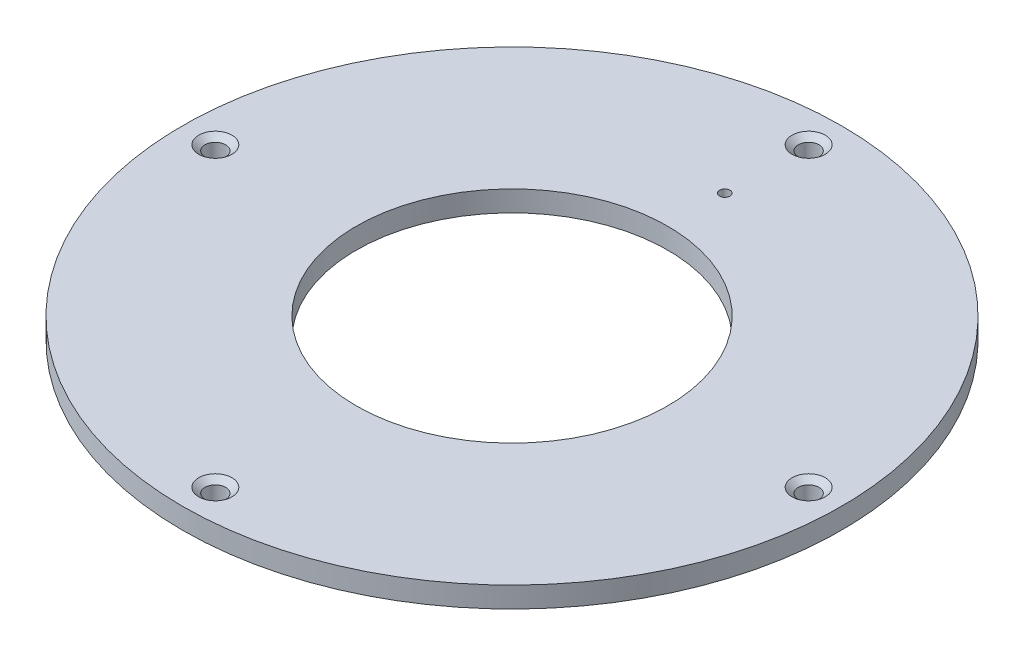
ISO-10303-21;
HEADER;
FILE_DESCRIPTION(('STEP AP214'),'2;1');
FILE_NAME('part.step','',(''),(''),'','','');
FILE_SCHEMA(('AUTOMOTIVE_DESIGN { 1 0 10303 214 1 1 1 1 }'));
ENDSEC;
DATA;
#1=APPLICATION_CONTEXT('core data for automotive mechanical design processes');
#2=APPLICATION_PROTOCOL_DEFINITION('international standard','automotive_design',2000,#1);
#3=PRODUCT_CONTEXT('',#1,'mechanical');
#4=PRODUCT('Part','Part','',(#3));
#5=PRODUCT_RELATED_PRODUCT_CATEGORY('part','',(#4));
#6=PRODUCT_DEFINITION_FORMATION('','',#4);
#7=PRODUCT_DEFINITION_CONTEXT('part definition',#1,'design');
#8=PRODUCT_DEFINITION('design','',#6,#7);
#9=PRODUCT_DEFINITION_SHAPE('','',#8);
#10=(LENGTH_UNIT() NAMED_UNIT(*) SI_UNIT(.MILLI.,.METRE.));
#11=(NAMED_UNIT(*) PLANE_ANGLE_UNIT() SI_UNIT($,.RADIAN.));
#12=(NAMED_UNIT(*) SI_UNIT($,.STERADIAN.) SOLID_ANGLE_UNIT());
#13=UNCERTAINTY_MEASURE_WITH_UNIT(LENGTH_MEASURE(1.E-05),#10,'distance_accuracy_value','');
#14=(GEOMETRIC_REPRESENTATION_CONTEXT(3) GLOBAL_UNCERTAINTY_ASSIGNED_CONTEXT((#13)) GLOBAL_UNIT_ASSIGNED_CONTEXT((#10,
#11,#12)) REPRESENTATION_CONTEXT('',''));
#15=CARTESIAN_POINT('',(0.,0.,0.));
#16=DIRECTION('',(0.,0.,1.));
#17=DIRECTION('',(1.,0.,0.));
#18=AXIS2_PLACEMENT_3D('',#15,#16,#17);
#19=CARTESIAN_POINT('',(0.,1.,0.));
#20=DIRECTION('',(0.,-1.,0.));
#21=DIRECTION('',(0.,0.,-1.));
#22=AXIS2_PLACEMENT_3D('',#19,#20,#21);
#23=CYLINDRICAL_SURFACE('',#22,15.875);
#24=CARTESIAN_POINT('',(0.,1.,0.));
#25=DIRECTION('',(0.,1.,0.));
#26=DIRECTION('',(0.,0.,1.));
#27=AXIS2_PLACEMENT_3D('',#24,#25,#26);
#28=CIRCLE('',#27,15.875);
#29=CARTESIAN_POINT('',(0.,1.,15.875));
#30=VERTEX_POINT('',#29);
#31=EDGE_CURVE('E10',#30,#30,#28,.T.);
#32=ORIENTED_EDGE('',*,*,#31,.F.);
#33=EDGE_LOOP('',(#32));
#34=FACE_BOUND('',#33,.T.);
#35=CARTESIAN_POINT('',(0.,0.,0.));
#36=DIRECTION('',(0.,1.,0.));
#37=DIRECTION('',(0.,0.,1.));
#38=AXIS2_PLACEMENT_3D('',#35,#36,#37);
#39=CIRCLE('',#38,15.875);
#40=CARTESIAN_POINT('',(0.,0.,15.875));
#41=VERTEX_POINT('',#40);
#42=EDGE_CURVE('E33',#41,#41,#39,.T.);
#43=ORIENTED_EDGE('',*,*,#42,.T.);
#44=EDGE_LOOP('',(#43));
#45=FACE_BOUND('',#44,.T.);
#46=ADVANCED_FACE('F30',(#34,#45),#23,.T.);
#47=CARTESIAN_POINT('',(0.,1.,0.));
#48=DIRECTION('',(0.,1.,0.));
#49=DIRECTION('',(0.,0.,1.));
#50=AXIS2_PLACEMENT_3D('',#47,#48,#49);
#51=PLANE('',#50);
#52=CARTESIAN_POINT('',(0.,1.,-14.29));
#53=DIRECTION('',(0.,1.,0.));
#54=DIRECTION('',(0.,0.,1.));
#55=AXIS2_PLACEMENT_3D('',#52,#53,#54);
#56=CIRCLE('',#55,0.8);
#57=CARTESIAN_POINT('',(0.,1.,-13.49));
#58=VERTEX_POINT('',#57);
#59=EDGE_CURVE('E86',#58,#58,#56,.T.);
#60=ORIENTED_EDGE('',*,*,#59,.F.);
#61=EDGE_LOOP('',(#60));
#62=FACE_BOUND('',#61,.T.);
#63=CARTESIAN_POINT('',(14.29,1.,0.));
#64=DIRECTION('',(0.,1.,0.));
#65=DIRECTION('',(0.,0.,1.));
#66=AXIS2_PLACEMENT_3D('',#63,#64,#65);
#67=CIRCLE('',#66,0.8);
#68=CARTESIAN_POINT('',(14.29,1.,0.8));
#69=VERTEX_POINT('',#68);
#70=EDGE_CURVE('E77',#69,#69,#67,.T.);
#71=ORIENTED_EDGE('',*,*,#70,.F.);
#72=EDGE_LOOP('',(#71));
#73=FACE_BOUND('',#72,.T.);
#74=CARTESIAN_POINT('',(0.,1.,14.29));
#75=DIRECTION('',(0.,1.,0.));
#76=DIRECTION('',(0.,0.,1.));
#77=AXIS2_PLACEMENT_3D('',#74,#75,#76);
#78=CIRCLE('',#77,0.8);
#79=CARTESIAN_POINT('',(0.,1.,15.09));
#80=VERTEX_POINT('',#79);
#81=EDGE_CURVE('E68',#80,#80,#78,.T.);
#82=ORIENTED_EDGE('',*,*,#81,.F.);
#83=EDGE_LOOP('',(#82));
#84=FACE_BOUND('',#83,.T.);
#85=CARTESIAN_POINT('',(-14.29,1.,0.));
#86=DIRECTION('',(0.,1.,0.));
#87=DIRECTION('',(0.,0.,1.));
#88=AXIS2_PLACEMENT_3D('',#85,#86,#87);
#89=CIRCLE('',#88,0.8);
#90=CARTESIAN_POINT('',(-14.29,1.,0.8));
#91=VERTEX_POINT('',#90);
#92=EDGE_CURVE('E59',#91,#91,#89,.T.);
#93=ORIENTED_EDGE('',*,*,#92,.F.);
#94=EDGE_LOOP('',(#93));
#95=FACE_BOUND('',#94,.T.);
#96=CARTESIAN_POINT('',(0.,1.,-10.25));
#97=DIRECTION('',(0.,1.,0.));
#98=DIRECTION('',(0.,0.,1.));
#99=AXIS2_PLACEMENT_3D('',#96,#97,#98);
#100=CIRCLE('',#99,0.25);
#101=CARTESIAN_POINT('',(0.,1.,-10.));
#102=VERTEX_POINT('',#101);
#103=EDGE_CURVE('E47',#102,#102,#100,.T.);
#104=ORIENTED_EDGE('',*,*,#103,.F.);
#105=EDGE_LOOP('',(#104));
#106=FACE_BOUND('',#105,.T.);
#107=CARTESIAN_POINT('',(0.,1.,0.));
#108=DIRECTION('',(0.,1.,0.));
#109=DIRECTION('',(0.,0.,1.));
#110=AXIS2_PLACEMENT_3D('',#107,#108,#109);
#111=CIRCLE('',#110,7.5);
#112=CARTESIAN_POINT('',(0.,1.,7.5));
#113=VERTEX_POINT('',#112);
#114=EDGE_CURVE('E40',#113,#113,#111,.T.);
#115=ORIENTED_EDGE('',*,*,#114,.F.);
#116=EDGE_LOOP('',(#115));
#117=FACE_BOUND('',#116,.T.);
#118=ORIENTED_EDGE('',*,*,#31,.T.);
#119=EDGE_LOOP('',(#118));
#120=FACE_BOUND('',#119,.T.);
#121=ADVANCED_FACE('F92',(#62,#73,#84,#95,#106,#117,#120),#51,.T.);
#122=CARTESIAN_POINT('',(0.,0.,0.));
#123=DIRECTION('',(0.,1.,0.));
#124=DIRECTION('',(0.,0.,1.));
#125=AXIS2_PLACEMENT_3D('',#122,#123,#124);
#126=PLANE('',#125);
#127=CARTESIAN_POINT('',(0.,0.,-14.29));
#128=DIRECTION('',(0.,1.,0.));
#129=DIRECTION('',(0.,0.,1.));
#130=AXIS2_PLACEMENT_3D('',#127,#128,#129);
#131=CIRCLE('',#130,0.499999999999988);
#132=CARTESIAN_POINT('',(0.,0.,-13.79));
#133=VERTEX_POINT('',#132);
#134=EDGE_CURVE('E80',#133,#133,#131,.T.);
#135=ORIENTED_EDGE('',*,*,#134,.T.);
#136=EDGE_LOOP('',(#135));
#137=FACE_BOUND('',#136,.T.);
#138=CARTESIAN_POINT('',(14.29,0.,0.));
#139=DIRECTION('',(0.,1.,0.));
#140=DIRECTION('',(0.,0.,1.));
#141=AXIS2_PLACEMENT_3D('',#138,#139,#140);
#142=CIRCLE('',#141,0.499999999999988);
#143=CARTESIAN_POINT('',(14.29,0.,0.499999999999988));
#144=VERTEX_POINT('',#143);
#145=EDGE_CURVE('E71',#144,#144,#142,.T.);
#146=ORIENTED_EDGE('',*,*,#145,.T.);
#147=EDGE_LOOP('',(#146));
#148=FACE_BOUND('',#147,.T.);
#149=CARTESIAN_POINT('',(0.,0.,14.29));
#150=DIRECTION('',(0.,1.,0.));
#151=DIRECTION('',(0.,0.,1.));
#152=AXIS2_PLACEMENT_3D('',#149,#150,#151);
#153=CIRCLE('',#152,0.499999999999988);
#154=CARTESIAN_POINT('',(0.,0.,14.79));
#155=VERTEX_POINT('',#154);
#156=EDGE_CURVE('E62',#155,#155,#153,.T.);
#157=ORIENTED_EDGE('',*,*,#156,.T.);
#158=EDGE_LOOP('',(#157));
#159=FACE_BOUND('',#158,.T.);
#160=CARTESIAN_POINT('',(-14.29,0.,0.));
#161=DIRECTION('',(0.,1.,0.));
#162=DIRECTION('',(0.,0.,1.));
#163=AXIS2_PLACEMENT_3D('',#160,#161,#162);
#164=CIRCLE('',#163,0.499999999999988);
#165=CARTESIAN_POINT('',(-14.29,0.,0.499999999999988));
#166=VERTEX_POINT('',#165);
#167=EDGE_CURVE('E53',#166,#166,#164,.T.);
#168=ORIENTED_EDGE('',*,*,#167,.T.);
#169=EDGE_LOOP('',(#168));
#170=FACE_BOUND('',#169,.T.);
#171=CARTESIAN_POINT('',(0.,0.,-10.25));
#172=DIRECTION('',(0.,1.,0.));
#173=DIRECTION('',(0.,0.,1.));
#174=AXIS2_PLACEMENT_3D('',#171,#172,#173);
#175=CIRCLE('',#174,0.25);
#176=CARTESIAN_POINT('',(0.,0.,-10.));
#177=VERTEX_POINT('',#176);
#178=EDGE_CURVE('E50',#177,#177,#175,.T.);
#179=ORIENTED_EDGE('',*,*,#178,.T.);
#180=EDGE_LOOP('',(#179));
#181=FACE_BOUND('',#180,.T.);
#182=CARTESIAN_POINT('',(0.,0.,0.));
#183=DIRECTION('',(0.,1.,0.));
#184=DIRECTION('',(0.,0.,1.));
#185=AXIS2_PLACEMENT_3D('',#182,#183,#184);
#186=CIRCLE('',#185,7.5);
#187=CARTESIAN_POINT('',(0.,0.,7.5));
#188=VERTEX_POINT('',#187);
#189=EDGE_CURVE('E44',#188,#188,#186,.T.);
#190=ORIENTED_EDGE('',*,*,#189,.T.);
#191=EDGE_LOOP('',(#190));
#192=FACE_BOUND('',#191,.T.);
#193=ORIENTED_EDGE('',*,*,#42,.F.);
#194=EDGE_LOOP('',(#193));
#195=FACE_BOUND('',#194,.T.);
#196=ADVANCED_FACE('F95',(#137,#148,#159,#170,#181,#192,#195),#126,.F.);
#197=CARTESIAN_POINT('',(0.,0.,0.));
#198=DIRECTION('',(0.,1.,0.));
#199=DIRECTION('',(0.,0.,1.));
#200=AXIS2_PLACEMENT_3D('',#197,#198,#199);
#201=CYLINDRICAL_SURFACE('',#200,7.5);
#202=ORIENTED_EDGE('',*,*,#114,.T.);
#203=EDGE_LOOP('',(#202));
#204=FACE_BOUND('',#203,.T.);
#205=ORIENTED_EDGE('',*,*,#189,.F.);
#206=EDGE_LOOP('',(#205));
#207=FACE_BOUND('',#206,.T.);
#208=ADVANCED_FACE('F107',(#204,#207),#201,.F.);
#209=CARTESIAN_POINT('',(0.,0.,-10.25));
#210=DIRECTION('',(0.,1.,0.));
#211=DIRECTION('',(0.,0.,1.));
#212=AXIS2_PLACEMENT_3D('',#209,#210,#211);
#213=CYLINDRICAL_SURFACE('',#212,0.25);
#214=ORIENTED_EDGE('',*,*,#103,.T.);
#215=EDGE_LOOP('',(#214));
#216=FACE_BOUND('',#215,.T.);
#217=ORIENTED_EDGE('',*,*,#178,.F.);
#218=EDGE_LOOP('',(#217));
#219=FACE_BOUND('',#218,.T.);
#220=ADVANCED_FACE('F110',(#216,#219),#213,.F.);
#221=CARTESIAN_POINT('',(-14.29,1.,0.));
#222=DIRECTION('',(0.,1.,0.));
#223=DIRECTION('',(0.,0.,1.));
#224=AXIS2_PLACEMENT_3D('',#221,#222,#223);
#225=CYLINDRICAL_SURFACE('',#224,0.499999999999988);
#226=ORIENTED_EDGE('',*,*,#167,.F.);
#227=EDGE_LOOP('',(#226));
#228=FACE_BOUND('',#227,.T.);
#229=CARTESIAN_POINT('',(-14.29,0.748270110646819,0.));
#230=DIRECTION('',(0.,1.,0.));
#231=DIRECTION('',(0.,0.,1.));
#232=AXIS2_PLACEMENT_3D('',#229,#230,#231);
#233=CIRCLE('',#232,0.499999999999988);
#234=CARTESIAN_POINT('',(-14.29,0.748270110646819,0.499999999999988));
#235=VERTEX_POINT('',#234);
#236=EDGE_CURVE('E56',#235,#235,#233,.T.);
#237=ORIENTED_EDGE('',*,*,#236,.T.);
#238=EDGE_LOOP('',(#237));
#239=FACE_BOUND('',#238,.T.);
#240=ADVANCED_FACE('F142',(#228,#239),#225,.F.);
#241=CARTESIAN_POINT('',(-14.29,1.,0.));
#242=DIRECTION('',(0.,1.,0.));
#243=DIRECTION('',(0.,0.,1.));
#244=AXIS2_PLACEMENT_3D('',#241,#242,#243);
#245=CONICAL_SURFACE('',#244,0.8,0.872664625997188);
#246=ORIENTED_EDGE('',*,*,#236,.F.);
#247=EDGE_LOOP('',(#246));
#248=FACE_BOUND('',#247,.T.);
#249=ORIENTED_EDGE('',*,*,#92,.T.);
#250=EDGE_LOOP('',(#249));
#251=FACE_BOUND('',#250,.T.);
#252=ADVANCED_FACE('F149',(#248,#251),#245,.F.);
#253=CARTESIAN_POINT('',(0.,1.,14.29));
#254=DIRECTION('',(0.,1.,0.));
#255=DIRECTION('',(0.,0.,1.));
#256=AXIS2_PLACEMENT_3D('',#253,#254,#255);
#257=CYLINDRICAL_SURFACE('',#256,0.499999999999988);
#258=ORIENTED_EDGE('',*,*,#156,.F.);
#259=EDGE_LOOP('',(#258));
#260=FACE_BOUND('',#259,.T.);
#261=CARTESIAN_POINT('',(0.,0.748270110646819,14.29));
#262=DIRECTION('',(0.,1.,0.));
#263=DIRECTION('',(0.,0.,1.));
#264=AXIS2_PLACEMENT_3D('',#261,#262,#263);
#265=CIRCLE('',#264,0.499999999999988);
#266=CARTESIAN_POINT('',(0.,0.748270110646819,14.79));
#267=VERTEX_POINT('',#266);
#268=EDGE_CURVE('E65',#267,#267,#265,.T.);
#269=ORIENTED_EDGE('',*,*,#268,.T.);
#270=EDGE_LOOP('',(#269));
#271=FACE_BOUND('',#270,.T.);
#272=ADVANCED_FACE('F157',(#260,#271),#257,.F.);
#273=CARTESIAN_POINT('',(0.,1.,14.29));
#274=DIRECTION('',(0.,1.,0.));
#275=DIRECTION('',(0.,0.,1.));
#276=AXIS2_PLACEMENT_3D('',#273,#274,#275);
#277=CONICAL_SURFACE('',#276,0.8,0.872664625997188);
#278=ORIENTED_EDGE('',*,*,#268,.F.);
#279=EDGE_LOOP('',(#278));
#280=FACE_BOUND('',#279,.T.);
#281=ORIENTED_EDGE('',*,*,#81,.T.);
#282=EDGE_LOOP('',(#281));
#283=FACE_BOUND('',#282,.T.);
#284=ADVANCED_FACE('F165',(#280,#283),#277,.F.);
#285=CARTESIAN_POINT('',(14.29,1.,0.));
#286=DIRECTION('',(0.,1.,0.));
#287=DIRECTION('',(0.,0.,1.));
#288=AXIS2_PLACEMENT_3D('',#285,#286,#287);
#289=CYLINDRICAL_SURFACE('',#288,0.499999999999988);
#290=ORIENTED_EDGE('',*,*,#145,.F.);
#291=EDGE_LOOP('',(#290));
#292=FACE_BOUND('',#291,.T.);
#293=CARTESIAN_POINT('',(14.29,0.748270110646819,0.));
#294=DIRECTION('',(0.,1.,0.));
#295=DIRECTION('',(0.,0.,1.));
#296=AXIS2_PLACEMENT_3D('',#293,#294,#295);
#297=CIRCLE('',#296,0.499999999999988);
#298=CARTESIAN_POINT('',(14.29,0.748270110646819,0.499999999999988));
#299=VERTEX_POINT('',#298);
#300=EDGE_CURVE('E74',#299,#299,#297,.T.);
#301=ORIENTED_EDGE('',*,*,#300,.T.);
#302=EDGE_LOOP('',(#301));
#303=FACE_BOUND('',#302,.T.);
#304=ADVANCED_FACE('F173',(#292,#303),#289,.F.);
#305=CARTESIAN_POINT('',(14.29,1.,0.));
#306=DIRECTION('',(0.,1.,0.));
#307=DIRECTION('',(0.,0.,1.));
#308=AXIS2_PLACEMENT_3D('',#305,#306,#307);
#309=CONICAL_SURFACE('',#308,0.8,0.872664625997188);
#310=ORIENTED_EDGE('',*,*,#300,.F.);
#311=EDGE_LOOP('',(#310));
#312=FACE_BOUND('',#311,.T.);
#313=ORIENTED_EDGE('',*,*,#70,.T.);
#314=EDGE_LOOP('',(#313));
#315=FACE_BOUND('',#314,.T.);
#316=ADVANCED_FACE('F181',(#312,#315),#309,.F.);
#317=CARTESIAN_POINT('',(0.,1.,-14.29));
#318=DIRECTION('',(0.,1.,0.));
#319=DIRECTION('',(0.,0.,1.));
#320=AXIS2_PLACEMENT_3D('',#317,#318,#319);
#321=CYLINDRICAL_SURFACE('',#320,0.499999999999988);
#322=ORIENTED_EDGE('',*,*,#134,.F.);
#323=EDGE_LOOP('',(#322));
#324=FACE_BOUND('',#323,.T.);
#325=CARTESIAN_POINT('',(0.,0.748270110646819,-14.29));
#326=DIRECTION('',(0.,1.,0.));
#327=DIRECTION('',(0.,0.,1.));
#328=AXIS2_PLACEMENT_3D('',#325,#326,#327);
#329=CIRCLE('',#328,0.499999999999988);
#330=CARTESIAN_POINT('',(0.,0.748270110646819,-13.79));
#331=VERTEX_POINT('',#330);
#332=EDGE_CURVE('E83',#331,#331,#329,.T.);
#333=ORIENTED_EDGE('',*,*,#332,.T.);
#334=EDGE_LOOP('',(#333));
#335=FACE_BOUND('',#334,.T.);
#336=ADVANCED_FACE('F189',(#324,#335),#321,.F.);
#337=CARTESIAN_POINT('',(0.,1.,-14.29));
#338=DIRECTION('',(0.,1.,0.));
#339=DIRECTION('',(0.,0.,1.));
#340=AXIS2_PLACEMENT_3D('',#337,#338,#339);
#341=CONICAL_SURFACE('',#340,0.8,0.872664625997188);
#342=ORIENTED_EDGE('',*,*,#332,.F.);
#343=EDGE_LOOP('',(#342));
#344=FACE_BOUND('',#343,.T.);
#345=ORIENTED_EDGE('',*,*,#59,.T.);
#346=EDGE_LOOP('',(#345));
#347=FACE_BOUND('',#346,.T.);
#348=ADVANCED_FACE('F90',(#344,#347),#341,.F.);
#349=CLOSED_SHELL('',(#46,#121,#196,#208,#220,#240,#252,#272,#284,#304,#316,#336,#348));
#350=MANIFOLD_SOLID_BREP('B2',#349);
#351=ADVANCED_BREP_SHAPE_REPRESENTATION('',(#18,#350),#14);
#352=SHAPE_DEFINITION_REPRESENTATION(#9,#351);
ENDSEC;
END-ISO-10303-21;
